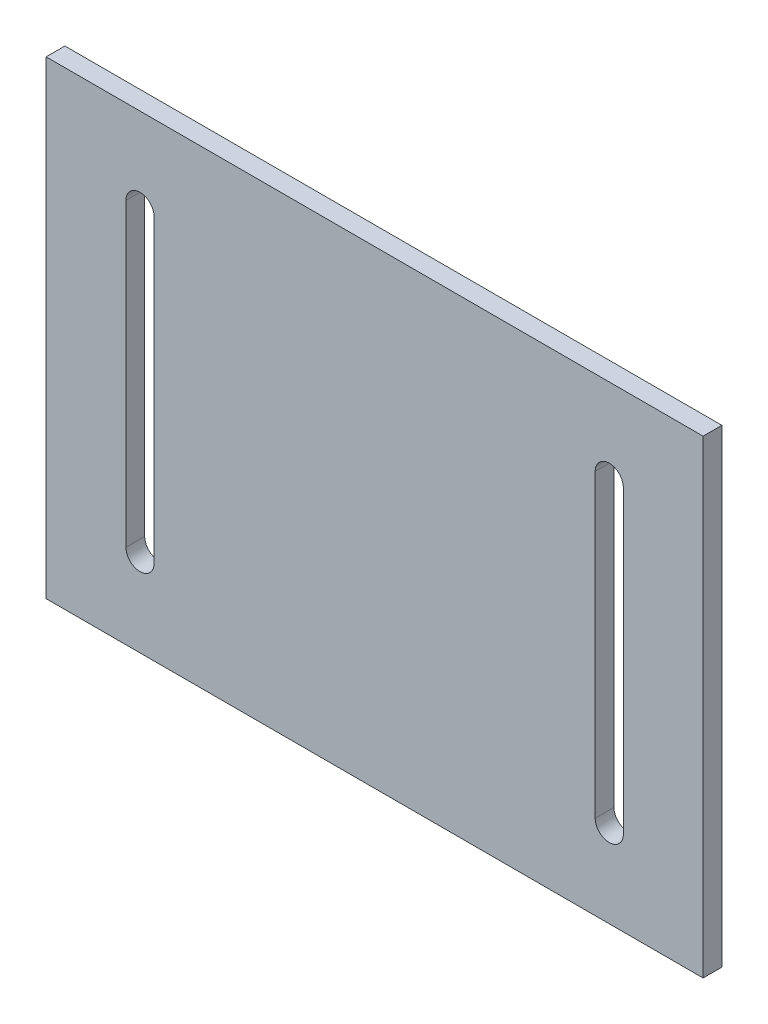
ISO-10303-21;
HEADER;
FILE_DESCRIPTION(('STEP AP214'),'2;1');
FILE_NAME('part.step','',(''),(''),'','','');
FILE_SCHEMA(('AUTOMOTIVE_DESIGN { 1 0 10303 214 1 1 1 1 }'));
ENDSEC;
DATA;
#1=APPLICATION_CONTEXT('core data for automotive mechanical design processes');
#2=APPLICATION_PROTOCOL_DEFINITION('international standard','automotive_design',2000,#1);
#3=PRODUCT_CONTEXT('',#1,'mechanical');
#4=PRODUCT('Part','Part','',(#3));
#5=PRODUCT_RELATED_PRODUCT_CATEGORY('part','',(#4));
#6=PRODUCT_DEFINITION_FORMATION('','',#4);
#7=PRODUCT_DEFINITION_CONTEXT('part definition',#1,'design');
#8=PRODUCT_DEFINITION('design','',#6,#7);
#9=PRODUCT_DEFINITION_SHAPE('','',#8);
#10=(LENGTH_UNIT() NAMED_UNIT(*) SI_UNIT(.MILLI.,.METRE.));
#11=(NAMED_UNIT(*) PLANE_ANGLE_UNIT() SI_UNIT($,.RADIAN.));
#12=(NAMED_UNIT(*) SI_UNIT($,.STERADIAN.) SOLID_ANGLE_UNIT());
#13=UNCERTAINTY_MEASURE_WITH_UNIT(LENGTH_MEASURE(1.E-05),#10,'distance_accuracy_value','');
#14=(GEOMETRIC_REPRESENTATION_CONTEXT(3) GLOBAL_UNCERTAINTY_ASSIGNED_CONTEXT((#13)) GLOBAL_UNIT_ASSIGNED_CONTEXT((#10,
#11,#12)) REPRESENTATION_CONTEXT('',''));
#15=CARTESIAN_POINT('',(0.,0.,0.));
#16=DIRECTION('',(0.,0.,1.));
#17=DIRECTION('',(1.,0.,0.));
#18=AXIS2_PLACEMENT_3D('',#15,#16,#17);
#19=CARTESIAN_POINT('',(60.,41.,-17.5));
#20=DIRECTION('',(0.,0.,-1.));
#21=DIRECTION('',(-1.,0.,0.));
#22=AXIS2_PLACEMENT_3D('',#19,#20,#21);
#23=CYLINDRICAL_SURFACE('',#22,1.5);
#24=DIRECTION('',(0.,0.,1.));
#25=VECTOR('',#24,1.);
#26=CARTESIAN_POINT('',(61.5,41.,-17.5));
#27=LINE('',#26,#25);
#28=CARTESIAN_POINT('',(61.5,41.,0.));
#29=VERTEX_POINT('',#28);
#30=CARTESIAN_POINT('',(61.5,41.,2.));
#31=VERTEX_POINT('',#30);
#32=EDGE_CURVE('E9',#29,#31,#27,.T.);
#33=ORIENTED_EDGE('',*,*,#32,.T.);
#34=CARTESIAN_POINT('',(60.,41.,2.));
#35=DIRECTION('',(0.,0.,-1.));
#36=DIRECTION('',(-1.,0.,0.));
#37=AXIS2_PLACEMENT_3D('',#34,#35,#36);
#38=CIRCLE('',#37,1.5);
#39=CARTESIAN_POINT('',(58.5,41.,2.));
#40=VERTEX_POINT('',#39);
#41=EDGE_CURVE('E180',#40,#31,#38,.T.);
#42=ORIENTED_EDGE('',*,*,#41,.F.);
#43=DIRECTION('',(0.,0.,1.));
#44=VECTOR('',#43,1.);
#45=CARTESIAN_POINT('',(58.5,41.,-17.5));
#46=LINE('',#45,#44);
#47=CARTESIAN_POINT('',(58.5,41.,0.));
#48=VERTEX_POINT('',#47);
#49=EDGE_CURVE('E38',#48,#40,#46,.T.);
#50=ORIENTED_EDGE('',*,*,#49,.F.);
#51=CARTESIAN_POINT('',(60.,41.,0.));
#52=DIRECTION('',(0.,0.,-1.));
#53=DIRECTION('',(-1.,0.,0.));
#54=AXIS2_PLACEMENT_3D('',#51,#52,#53);
#55=CIRCLE('',#54,1.5);
#56=EDGE_CURVE('E260',#48,#29,#55,.T.);
#57=ORIENTED_EDGE('',*,*,#56,.T.);
#58=EDGE_LOOP('',(#33,#42,#50,#57));
#59=FACE_BOUND('',#58,.T.);
#60=ADVANCED_FACE('F15',(#59),#23,.F.);
#61=CARTESIAN_POINT('',(61.5,41.,-17.5));
#62=DIRECTION('',(1.,0.,0.));
#63=DIRECTION('',(0.,-1.,0.));
#64=AXIS2_PLACEMENT_3D('',#61,#62,#63);
#65=PLANE('',#64);
#66=DIRECTION('',(0.,0.,1.));
#67=VECTOR('',#66,1.);
#68=CARTESIAN_POINT('',(61.5,9.,-17.5));
#69=LINE('',#68,#67);
#70=CARTESIAN_POINT('',(61.5,9.,0.));
#71=VERTEX_POINT('',#70);
#72=CARTESIAN_POINT('',(61.5,9.,2.));
#73=VERTEX_POINT('',#72);
#74=EDGE_CURVE('E24',#71,#73,#69,.T.);
#75=ORIENTED_EDGE('',*,*,#74,.T.);
#76=DIRECTION('',(0.,1.,0.));
#77=VECTOR('',#76,1.);
#78=CARTESIAN_POINT('',(61.5,20.5,2.));
#79=LINE('',#78,#77);
#80=EDGE_CURVE('E185',#73,#31,#79,.T.);
#81=ORIENTED_EDGE('',*,*,#80,.T.);
#82=ORIENTED_EDGE('',*,*,#32,.F.);
#83=DIRECTION('',(0.,1.,0.));
#84=VECTOR('',#83,1.);
#85=CARTESIAN_POINT('',(61.5,20.5,0.));
#86=LINE('',#85,#84);
#87=EDGE_CURVE('E251',#71,#29,#86,.T.);
#88=ORIENTED_EDGE('',*,*,#87,.F.);
#89=EDGE_LOOP('',(#75,#81,#82,#88));
#90=FACE_BOUND('',#89,.T.);
#91=ADVANCED_FACE('F17',(#90),#65,.F.);
#92=CARTESIAN_POINT('',(60.,9.,-17.5));
#93=DIRECTION('',(0.,0.,-1.));
#94=DIRECTION('',(1.,0.,0.));
#95=AXIS2_PLACEMENT_3D('',#92,#93,#94);
#96=CYLINDRICAL_SURFACE('',#95,1.5);
#97=DIRECTION('',(0.,0.,1.));
#98=VECTOR('',#97,1.);
#99=CARTESIAN_POINT('',(58.5,9.,-17.5));
#100=LINE('',#99,#98);
#101=CARTESIAN_POINT('',(58.5,9.,0.));
#102=VERTEX_POINT('',#101);
#103=CARTESIAN_POINT('',(58.5,9.,2.));
#104=VERTEX_POINT('',#103);
#105=EDGE_CURVE('E183',#102,#104,#100,.T.);
#106=ORIENTED_EDGE('',*,*,#105,.T.);
#107=CARTESIAN_POINT('',(60.,9.,2.));
#108=DIRECTION('',(0.,0.,-1.));
#109=DIRECTION('',(1.,0.,0.));
#110=AXIS2_PLACEMENT_3D('',#107,#108,#109);
#111=CIRCLE('',#110,1.5);
#112=EDGE_CURVE('E214',#73,#104,#111,.T.);
#113=ORIENTED_EDGE('',*,*,#112,.F.);
#114=ORIENTED_EDGE('',*,*,#74,.F.);
#115=CARTESIAN_POINT('',(60.,9.,0.));
#116=DIRECTION('',(0.,0.,-1.));
#117=DIRECTION('',(1.,0.,0.));
#118=AXIS2_PLACEMENT_3D('',#115,#116,#117);
#119=CIRCLE('',#118,1.5);
#120=EDGE_CURVE('E247',#71,#102,#119,.T.);
#121=ORIENTED_EDGE('',*,*,#120,.T.);
#122=EDGE_LOOP('',(#106,#113,#114,#121));
#123=FACE_BOUND('',#122,.T.);
#124=ADVANCED_FACE('F273',(#123),#96,.F.);
#125=CARTESIAN_POINT('',(58.5,9.,-17.5));
#126=DIRECTION('',(-1.,0.,0.));
#127=DIRECTION('',(0.,0.,1.));
#128=AXIS2_PLACEMENT_3D('',#125,#126,#127);
#129=PLANE('',#128);
#130=ORIENTED_EDGE('',*,*,#49,.T.);
#131=DIRECTION('',(0.,-1.,0.));
#132=VECTOR('',#131,1.);
#133=CARTESIAN_POINT('',(58.5,4.5,2.));
#134=LINE('',#133,#132);
#135=EDGE_CURVE('E181',#40,#104,#134,.T.);
#136=ORIENTED_EDGE('',*,*,#135,.T.);
#137=ORIENTED_EDGE('',*,*,#105,.F.);
#138=DIRECTION('',(0.,-1.,0.));
#139=VECTOR('',#138,1.);
#140=CARTESIAN_POINT('',(58.5,4.5,0.));
#141=LINE('',#140,#139);
#142=EDGE_CURVE('E230',#48,#102,#141,.T.);
#143=ORIENTED_EDGE('',*,*,#142,.F.);
#144=EDGE_LOOP('',(#130,#136,#137,#143));
#145=FACE_BOUND('',#144,.T.);
#146=ADVANCED_FACE('F284',(#145),#129,.F.);
#147=CARTESIAN_POINT('',(11.5,41.,-17.5));
#148=DIRECTION('',(1.,0.,0.));
#149=DIRECTION('',(0.,-1.,0.));
#150=AXIS2_PLACEMENT_3D('',#147,#148,#149);
#151=PLANE('',#150);
#152=DIRECTION('',(0.,0.,1.));
#153=VECTOR('',#152,1.);
#154=CARTESIAN_POINT('',(11.5,9.,-17.5));
#155=LINE('',#154,#153);
#156=CARTESIAN_POINT('',(11.5,9.,0.));
#157=VERTEX_POINT('',#156);
#158=CARTESIAN_POINT('',(11.5,9.,2.));
#159=VERTEX_POINT('',#158);
#160=EDGE_CURVE('E198',#157,#159,#155,.T.);
#161=ORIENTED_EDGE('',*,*,#160,.T.);
#162=DIRECTION('',(0.,1.,0.));
#163=VECTOR('',#162,1.);
#164=CARTESIAN_POINT('',(11.5,20.5,2.));
#165=LINE('',#164,#163);
#166=CARTESIAN_POINT('',(11.5,41.,2.));
#167=VERTEX_POINT('',#166);
#168=EDGE_CURVE('E166',#159,#167,#165,.T.);
#169=ORIENTED_EDGE('',*,*,#168,.T.);
#170=DIRECTION('',(0.,0.,1.));
#171=VECTOR('',#170,1.);
#172=CARTESIAN_POINT('',(11.5,41.,-17.5));
#173=LINE('',#172,#171);
#174=CARTESIAN_POINT('',(11.5,41.,0.));
#175=VERTEX_POINT('',#174);
#176=EDGE_CURVE('E193',#175,#167,#173,.T.);
#177=ORIENTED_EDGE('',*,*,#176,.F.);
#178=DIRECTION('',(0.,1.,0.));
#179=VECTOR('',#178,1.);
#180=CARTESIAN_POINT('',(11.5,20.5,0.));
#181=LINE('',#180,#179);
#182=EDGE_CURVE('E236',#157,#175,#181,.T.);
#183=ORIENTED_EDGE('',*,*,#182,.F.);
#184=EDGE_LOOP('',(#161,#169,#177,#183));
#185=FACE_BOUND('',#184,.T.);
#186=ADVANCED_FACE('F285',(#185),#151,.F.);
#187=CARTESIAN_POINT('',(10.,9.,-17.5));
#188=DIRECTION('',(0.,0.,-1.));
#189=DIRECTION('',(1.,0.,0.));
#190=AXIS2_PLACEMENT_3D('',#187,#188,#189);
#191=CYLINDRICAL_SURFACE('',#190,1.5);
#192=DIRECTION('',(0.,0.,1.));
#193=VECTOR('',#192,1.);
#194=CARTESIAN_POINT('',(8.5,9.,-17.5));
#195=LINE('',#194,#193);
#196=CARTESIAN_POINT('',(8.5,9.,0.));
#197=VERTEX_POINT('',#196);
#198=CARTESIAN_POINT('',(8.5,9.,2.));
#199=VERTEX_POINT('',#198);
#200=EDGE_CURVE('E197',#197,#199,#195,.T.);
#201=ORIENTED_EDGE('',*,*,#200,.T.);
#202=CARTESIAN_POINT('',(10.,9.,2.));
#203=DIRECTION('',(0.,0.,-1.));
#204=DIRECTION('',(1.,0.,0.));
#205=AXIS2_PLACEMENT_3D('',#202,#203,#204);
#206=CIRCLE('',#205,1.5);
#207=EDGE_CURVE('E174',#159,#199,#206,.T.);
#208=ORIENTED_EDGE('',*,*,#207,.F.);
#209=ORIENTED_EDGE('',*,*,#160,.F.);
#210=CARTESIAN_POINT('',(10.,9.,0.));
#211=DIRECTION('',(0.,0.,-1.));
#212=DIRECTION('',(1.,0.,0.));
#213=AXIS2_PLACEMENT_3D('',#210,#211,#212);
#214=CIRCLE('',#213,1.5);
#215=EDGE_CURVE('E233',#157,#197,#214,.T.);
#216=ORIENTED_EDGE('',*,*,#215,.T.);
#217=EDGE_LOOP('',(#201,#208,#209,#216));
#218=FACE_BOUND('',#217,.T.);
#219=ADVANCED_FACE('F291',(#218),#191,.F.);
#220=CARTESIAN_POINT('',(10.,41.,-17.5));
#221=DIRECTION('',(0.,0.,-1.));
#222=DIRECTION('',(-1.,0.,0.));
#223=AXIS2_PLACEMENT_3D('',#220,#221,#222);
#224=CYLINDRICAL_SURFACE('',#223,1.5);
#225=ORIENTED_EDGE('',*,*,#176,.T.);
#226=CARTESIAN_POINT('',(10.,41.,2.));
#227=DIRECTION('',(0.,0.,-1.));
#228=DIRECTION('',(-1.,0.,0.));
#229=AXIS2_PLACEMENT_3D('',#226,#227,#228);
#230=CIRCLE('',#229,1.5);
#231=CARTESIAN_POINT('',(8.5,41.,2.));
#232=VERTEX_POINT('',#231);
#233=EDGE_CURVE('E173',#232,#167,#230,.T.);
#234=ORIENTED_EDGE('',*,*,#233,.F.);
#235=DIRECTION('',(0.,0.,1.));
#236=VECTOR('',#235,1.);
#237=CARTESIAN_POINT('',(8.5,41.,-17.5));
#238=LINE('',#237,#236);
#239=CARTESIAN_POINT('',(8.5,41.,0.));
#240=VERTEX_POINT('',#239);
#241=EDGE_CURVE('E227',#240,#232,#238,.T.);
#242=ORIENTED_EDGE('',*,*,#241,.F.);
#243=CARTESIAN_POINT('',(10.,41.,0.));
#244=DIRECTION('',(0.,0.,-1.));
#245=DIRECTION('',(-1.,0.,0.));
#246=AXIS2_PLACEMENT_3D('',#243,#244,#245);
#247=CIRCLE('',#246,1.5);
#248=EDGE_CURVE('E241',#240,#175,#247,.T.);
#249=ORIENTED_EDGE('',*,*,#248,.T.);
#250=EDGE_LOOP('',(#225,#234,#242,#249));
#251=FACE_BOUND('',#250,.T.);
#252=ADVANCED_FACE('F307',(#251),#224,.F.);
#253=CARTESIAN_POINT('',(8.5,9.,-17.5));
#254=DIRECTION('',(-1.,0.,0.));
#255=DIRECTION('',(0.,0.,1.));
#256=AXIS2_PLACEMENT_3D('',#253,#254,#255);
#257=PLANE('',#256);
#258=ORIENTED_EDGE('',*,*,#241,.T.);
#259=DIRECTION('',(0.,-1.,0.));
#260=VECTOR('',#259,1.);
#261=CARTESIAN_POINT('',(8.5,4.5,2.));
#262=LINE('',#261,#260);
#263=EDGE_CURVE('E199',#232,#199,#262,.T.);
#264=ORIENTED_EDGE('',*,*,#263,.T.);
#265=ORIENTED_EDGE('',*,*,#200,.F.);
#266=DIRECTION('',(0.,-1.,0.));
#267=VECTOR('',#266,1.);
#268=CARTESIAN_POINT('',(8.5,4.5,0.));
#269=LINE('',#268,#267);
#270=EDGE_CURVE('E244',#240,#197,#269,.T.);
#271=ORIENTED_EDGE('',*,*,#270,.F.);
#272=EDGE_LOOP('',(#258,#264,#265,#271));
#273=FACE_BOUND('',#272,.T.);
#274=ADVANCED_FACE('F309',(#273),#257,.F.);
#275=CARTESIAN_POINT('',(70.,0.,0.));
#276=DIRECTION('',(1.,0.,0.));
#277=DIRECTION('',(0.,1.,0.));
#278=AXIS2_PLACEMENT_3D('',#275,#276,#277);
#279=PLANE('',#278);
#280=DIRECTION('',(0.,0.,1.));
#281=VECTOR('',#280,1.);
#282=CARTESIAN_POINT('',(70.,0.,0.));
#283=LINE('',#282,#281);
#284=CARTESIAN_POINT('',(70.,0.,0.));
#285=VERTEX_POINT('',#284);
#286=CARTESIAN_POINT('',(70.,0.,2.));
#287=VERTEX_POINT('',#286);
#288=EDGE_CURVE('E142',#285,#287,#283,.T.);
#289=ORIENTED_EDGE('',*,*,#288,.F.);
#290=DIRECTION('',(0.,1.,0.));
#291=VECTOR('',#290,1.);
#292=CARTESIAN_POINT('',(70.,0.,0.));
#293=LINE('',#292,#291);
#294=CARTESIAN_POINT('',(70.,50.,0.));
#295=VERTEX_POINT('',#294);
#296=EDGE_CURVE('E226',#285,#295,#293,.T.);
#297=ORIENTED_EDGE('',*,*,#296,.T.);
#298=DIRECTION('',(0.,0.,1.));
#299=VECTOR('',#298,1.);
#300=CARTESIAN_POINT('',(70.,50.,0.));
#301=LINE('',#300,#299);
#302=CARTESIAN_POINT('',(70.,50.,2.));
#303=VERTEX_POINT('',#302);
#304=EDGE_CURVE('E224',#295,#303,#301,.T.);
#305=ORIENTED_EDGE('',*,*,#304,.T.);
#306=DIRECTION('',(0.,1.,0.));
#307=VECTOR('',#306,1.);
#308=CARTESIAN_POINT('',(70.,0.,2.));
#309=LINE('',#308,#307);
#310=EDGE_CURVE('E189',#287,#303,#309,.T.);
#311=ORIENTED_EDGE('',*,*,#310,.F.);
#312=EDGE_LOOP('',(#289,#297,#305,#311));
#313=FACE_BOUND('',#312,.T.);
#314=ADVANCED_FACE('F314',(#313),#279,.T.);
#315=CARTESIAN_POINT('',(0.,0.,0.));
#316=DIRECTION('',(0.,0.,1.));
#317=DIRECTION('',(1.,0.,0.));
#318=AXIS2_PLACEMENT_3D('',#315,#316,#317);
#319=PLANE('',#318);
#320=ORIENTED_EDGE('',*,*,#120,.F.);
#321=ORIENTED_EDGE('',*,*,#87,.T.);
#322=ORIENTED_EDGE('',*,*,#56,.F.);
#323=ORIENTED_EDGE('',*,*,#142,.T.);
#324=EDGE_LOOP('',(#320,#321,#322,#323));
#325=FACE_BOUND('',#324,.T.);
#326=ORIENTED_EDGE('',*,*,#215,.F.);
#327=ORIENTED_EDGE('',*,*,#182,.T.);
#328=ORIENTED_EDGE('',*,*,#248,.F.);
#329=ORIENTED_EDGE('',*,*,#270,.T.);
#330=EDGE_LOOP('',(#326,#327,#328,#329));
#331=FACE_BOUND('',#330,.T.);
#332=DIRECTION('',(1.,0.,0.));
#333=VECTOR('',#332,1.);
#334=CARTESIAN_POINT('',(0.,50.,0.));
#335=LINE('',#334,#333);
#336=CARTESIAN_POINT('',(0.,50.,0.));
#337=VERTEX_POINT('',#336);
#338=EDGE_CURVE('E218',#337,#295,#335,.T.);
#339=ORIENTED_EDGE('',*,*,#338,.T.);
#340=ORIENTED_EDGE('',*,*,#296,.F.);
#341=DIRECTION('',(1.,0.,0.));
#342=VECTOR('',#341,1.);
#343=CARTESIAN_POINT('',(0.,0.,0.));
#344=LINE('',#343,#342);
#345=CARTESIAN_POINT('',(0.,0.,0.));
#346=VERTEX_POINT('',#345);
#347=EDGE_CURVE('E150',#346,#285,#344,.T.);
#348=ORIENTED_EDGE('',*,*,#347,.F.);
#349=DIRECTION('',(0.,1.,0.));
#350=VECTOR('',#349,1.);
#351=CARTESIAN_POINT('',(0.,0.,0.));
#352=LINE('',#351,#350);
#353=EDGE_CURVE('E154',#346,#337,#352,.T.);
#354=ORIENTED_EDGE('',*,*,#353,.T.);
#355=EDGE_LOOP('',(#339,#340,#348,#354));
#356=FACE_BOUND('',#355,.T.);
#357=ADVANCED_FACE('F278',(#325,#331,#356),#319,.F.);
#358=CARTESIAN_POINT('',(0.,50.,0.));
#359=DIRECTION('',(0.,1.,0.));
#360=DIRECTION('',(1.,0.,0.));
#361=AXIS2_PLACEMENT_3D('',#358,#359,#360);
#362=PLANE('',#361);
#363=ORIENTED_EDGE('',*,*,#338,.F.);
#364=DIRECTION('',(0.,0.,1.));
#365=VECTOR('',#364,1.);
#366=CARTESIAN_POINT('',(0.,50.,0.));
#367=LINE('',#366,#365);
#368=CARTESIAN_POINT('',(0.,50.,2.));
#369=VERTEX_POINT('',#368);
#370=EDGE_CURVE('E162',#337,#369,#367,.T.);
#371=ORIENTED_EDGE('',*,*,#370,.T.);
#372=DIRECTION('',(1.,0.,0.));
#373=VECTOR('',#372,1.);
#374=CARTESIAN_POINT('',(0.,50.,2.));
#375=LINE('',#374,#373);
#376=EDGE_CURVE('E159',#369,#303,#375,.T.);
#377=ORIENTED_EDGE('',*,*,#376,.T.);
#378=ORIENTED_EDGE('',*,*,#304,.F.);
#379=EDGE_LOOP('',(#363,#371,#377,#378));
#380=FACE_BOUND('',#379,.T.);
#381=ADVANCED_FACE('F303',(#380),#362,.T.);
#382=CARTESIAN_POINT('',(0.,0.,2.));
#383=DIRECTION('',(0.,0.,1.));
#384=DIRECTION('',(1.,0.,0.));
#385=AXIS2_PLACEMENT_3D('',#382,#383,#384);
#386=PLANE('',#385);
#387=ORIENTED_EDGE('',*,*,#135,.F.);
#388=ORIENTED_EDGE('',*,*,#41,.T.);
#389=ORIENTED_EDGE('',*,*,#80,.F.);
#390=ORIENTED_EDGE('',*,*,#112,.T.);
#391=EDGE_LOOP('',(#387,#388,#389,#390));
#392=FACE_BOUND('',#391,.T.);
#393=ORIENTED_EDGE('',*,*,#263,.F.);
#394=ORIENTED_EDGE('',*,*,#233,.T.);
#395=ORIENTED_EDGE('',*,*,#168,.F.);
#396=ORIENTED_EDGE('',*,*,#207,.T.);
#397=EDGE_LOOP('',(#393,#394,#395,#396));
#398=FACE_BOUND('',#397,.T.);
#399=DIRECTION('',(0.,1.,0.));
#400=VECTOR('',#399,1.);
#401=CARTESIAN_POINT('',(0.,0.,2.));
#402=LINE('',#401,#400);
#403=CARTESIAN_POINT('',(0.,0.,2.));
#404=VERTEX_POINT('',#403);
#405=EDGE_CURVE('E153',#404,#369,#402,.T.);
#406=ORIENTED_EDGE('',*,*,#405,.F.);
#407=DIRECTION('',(1.,0.,0.));
#408=VECTOR('',#407,1.);
#409=CARTESIAN_POINT('',(0.,0.,2.));
#410=LINE('',#409,#408);
#411=EDGE_CURVE('E134',#404,#287,#410,.T.);
#412=ORIENTED_EDGE('',*,*,#411,.T.);
#413=ORIENTED_EDGE('',*,*,#310,.T.);
#414=ORIENTED_EDGE('',*,*,#376,.F.);
#415=EDGE_LOOP('',(#406,#412,#413,#414));
#416=FACE_BOUND('',#415,.T.);
#417=ADVANCED_FACE('F158',(#392,#398,#416),#386,.T.);
#418=CARTESIAN_POINT('',(0.,0.,0.));
#419=DIRECTION('',(0.,1.,0.));
#420=DIRECTION('',(1.,0.,0.));
#421=AXIS2_PLACEMENT_3D('',#418,#419,#420);
#422=PLANE('',#421);
#423=ORIENTED_EDGE('',*,*,#288,.T.);
#424=ORIENTED_EDGE('',*,*,#411,.F.);
#425=DIRECTION('',(0.,0.,1.));
#426=VECTOR('',#425,1.);
#427=CARTESIAN_POINT('',(0.,0.,0.));
#428=LINE('',#427,#426);
#429=EDGE_CURVE('E137',#346,#404,#428,.T.);
#430=ORIENTED_EDGE('',*,*,#429,.F.);
#431=ORIENTED_EDGE('',*,*,#347,.T.);
#432=EDGE_LOOP('',(#423,#424,#430,#431));
#433=FACE_BOUND('',#432,.T.);
#434=ADVANCED_FACE('F140',(#433),#422,.F.);
#435=CARTESIAN_POINT('',(0.,0.,0.));
#436=DIRECTION('',(1.,0.,0.));
#437=DIRECTION('',(0.,1.,0.));
#438=AXIS2_PLACEMENT_3D('',#435,#436,#437);
#439=PLANE('',#438);
#440=ORIENTED_EDGE('',*,*,#405,.T.);
#441=ORIENTED_EDGE('',*,*,#370,.F.);
#442=ORIENTED_EDGE('',*,*,#353,.F.);
#443=ORIENTED_EDGE('',*,*,#429,.T.);
#444=EDGE_LOOP('',(#440,#441,#442,#443));
#445=FACE_BOUND('',#444,.T.);
#446=ADVANCED_FACE('F151',(#445),#439,.F.);
#447=CLOSED_SHELL('',(#60,#91,#124,#146,#186,#219,#252,#274,#314,#357,#381,#417,#434,#446));
#448=MANIFOLD_SOLID_BREP('B1',#447);
#449=ADVANCED_BREP_SHAPE_REPRESENTATION('',(#18,#448),#14);
#450=SHAPE_DEFINITION_REPRESENTATION(#9,#449);
ENDSEC;
END-ISO-10303-21;
